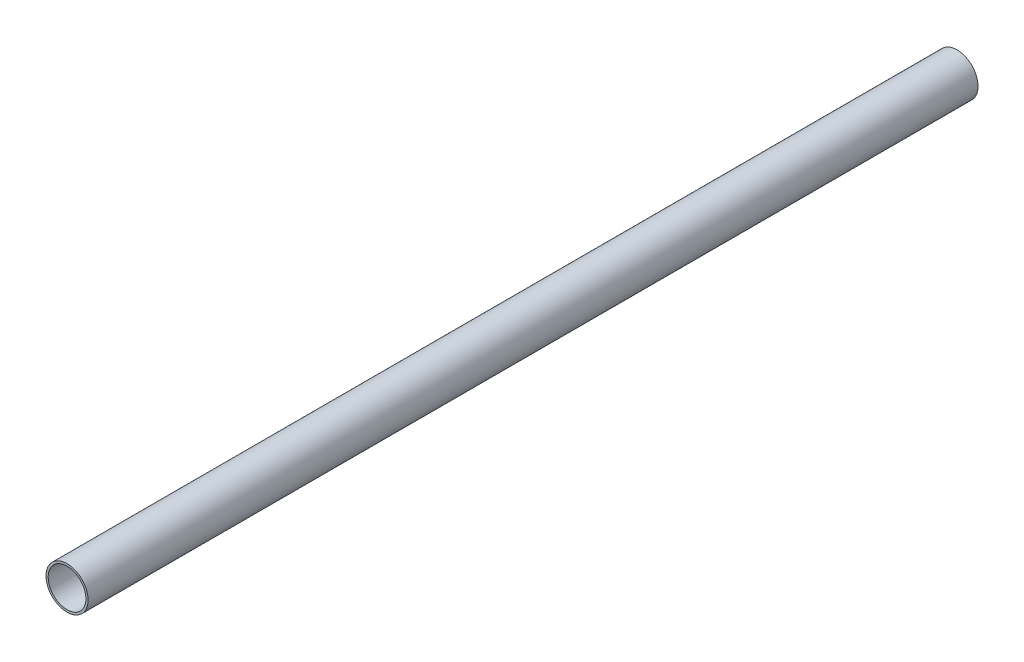
ISO-10303-21;
HEADER;
FILE_DESCRIPTION(('STEP AP214'),'2;1');
FILE_NAME('part.step','',(''),(''),'','','');
FILE_SCHEMA(('AUTOMOTIVE_DESIGN { 1 0 10303 214 1 1 1 1 }'));
ENDSEC;
DATA;
#1=APPLICATION_CONTEXT('core data for automotive mechanical design processes');
#2=APPLICATION_PROTOCOL_DEFINITION('international standard','automotive_design',2000,#1);
#3=PRODUCT_CONTEXT('',#1,'mechanical');
#4=PRODUCT('Part','Part','',(#3));
#5=PRODUCT_RELATED_PRODUCT_CATEGORY('part','',(#4));
#6=PRODUCT_DEFINITION_FORMATION('','',#4);
#7=PRODUCT_DEFINITION_CONTEXT('part definition',#1,'design');
#8=PRODUCT_DEFINITION('design','',#6,#7);
#9=PRODUCT_DEFINITION_SHAPE('','',#8);
#10=(LENGTH_UNIT() NAMED_UNIT(*) SI_UNIT(.MILLI.,.METRE.));
#11=(NAMED_UNIT(*) PLANE_ANGLE_UNIT() SI_UNIT($,.RADIAN.));
#12=(NAMED_UNIT(*) SI_UNIT($,.STERADIAN.) SOLID_ANGLE_UNIT());
#13=UNCERTAINTY_MEASURE_WITH_UNIT(LENGTH_MEASURE(1.E-05),#10,'distance_accuracy_value','');
#14=(GEOMETRIC_REPRESENTATION_CONTEXT(3) GLOBAL_UNCERTAINTY_ASSIGNED_CONTEXT((#13)) GLOBAL_UNIT_ASSIGNED_CONTEXT((#10,
#11,#12)) REPRESENTATION_CONTEXT('',''));
#15=CARTESIAN_POINT('',(0.,0.,0.));
#16=DIRECTION('',(0.,0.,1.));
#17=DIRECTION('',(1.,0.,0.));
#18=AXIS2_PLACEMENT_3D('',#15,#16,#17);
#19=CARTESIAN_POINT('',(0.,0.,235.));
#20=DIRECTION('',(0.,0.,1.));
#21=DIRECTION('',(1.,0.,0.));
#22=AXIS2_PLACEMENT_3D('',#19,#20,#21);
#23=PLANE('',#22);
#24=CARTESIAN_POINT('',(0.,0.,235.));
#25=DIRECTION('',(0.,0.,1.));
#26=DIRECTION('',(1.,0.,0.));
#27=AXIS2_PLACEMENT_3D('',#24,#25,#26);
#28=CIRCLE('',#27,11.1125);
#29=CARTESIAN_POINT('',(-11.1125,0.,235.));
#30=VERTEX_POINT('',#29);
#31=EDGE_CURVE('E10',#30,#30,#28,.T.);
#32=ORIENTED_EDGE('',*,*,#31,.T.);
#33=EDGE_LOOP('',(#32));
#34=FACE_BOUND('',#33,.T.);
#35=CARTESIAN_POINT('',(0.,0.,235.));
#36=DIRECTION('',(0.,0.,1.));
#37=DIRECTION('',(1.,0.,0.));
#38=AXIS2_PLACEMENT_3D('',#35,#36,#37);
#39=CIRCLE('',#38,9.9695);
#40=CARTESIAN_POINT('',(-9.9695,0.,235.));
#41=VERTEX_POINT('',#40);
#42=EDGE_CURVE('E41',#41,#41,#39,.T.);
#43=ORIENTED_EDGE('',*,*,#42,.F.);
#44=EDGE_LOOP('',(#43));
#45=FACE_BOUND('',#44,.T.);
#46=ADVANCED_FACE('F30',(#34,#45),#23,.T.);
#47=CARTESIAN_POINT('',(0.,0.,-235.));
#48=DIRECTION('',(0.,0.,1.));
#49=DIRECTION('',(1.,0.,0.));
#50=AXIS2_PLACEMENT_3D('',#47,#48,#49);
#51=PLANE('',#50);
#52=CARTESIAN_POINT('',(0.,0.,-235.));
#53=DIRECTION('',(0.,0.,1.));
#54=DIRECTION('',(1.,0.,0.));
#55=AXIS2_PLACEMENT_3D('',#52,#53,#54);
#56=CIRCLE('',#55,11.1125);
#57=CARTESIAN_POINT('',(-11.1125,0.,-235.));
#58=VERTEX_POINT('',#57);
#59=EDGE_CURVE('E34',#58,#58,#56,.T.);
#60=ORIENTED_EDGE('',*,*,#59,.F.);
#61=EDGE_LOOP('',(#60));
#62=FACE_BOUND('',#61,.T.);
#63=CARTESIAN_POINT('',(0.,0.,-235.));
#64=DIRECTION('',(0.,0.,1.));
#65=DIRECTION('',(1.,0.,0.));
#66=AXIS2_PLACEMENT_3D('',#63,#64,#65);
#67=CIRCLE('',#66,9.9695);
#68=CARTESIAN_POINT('',(-9.9695,0.,-235.));
#69=VERTEX_POINT('',#68);
#70=EDGE_CURVE('E43',#69,#69,#67,.T.);
#71=ORIENTED_EDGE('',*,*,#70,.T.);
#72=EDGE_LOOP('',(#71));
#73=FACE_BOUND('',#72,.T.);
#74=ADVANCED_FACE('F53',(#62,#73),#51,.F.);
#75=CARTESIAN_POINT('',(0.,0.,235.));
#76=DIRECTION('',(0.,0.,-1.));
#77=DIRECTION('',(-1.,0.,0.));
#78=AXIS2_PLACEMENT_3D('',#75,#76,#77);
#79=CYLINDRICAL_SURFACE('',#78,11.1125);
#80=CARTESIAN_POINT('',(-11.1125,0.,235.));
#81=CARTESIAN_POINT('',(-11.1125,0.,230.104166666667));
#82=CARTESIAN_POINT('',(-11.1125,0.,225.208333333333));
#83=CARTESIAN_POINT('',(-11.1125,0.,215.416666666667));
#84=CARTESIAN_POINT('',(-11.1125,0.,210.520833333333));
#85=CARTESIAN_POINT('',(-11.1125,0.,200.729166666667));
#86=CARTESIAN_POINT('',(-11.1125,0.,195.833333333333));
#87=CARTESIAN_POINT('',(-11.1125,0.,186.041666666667));
#88=CARTESIAN_POINT('',(-11.1125,0.,181.145833333333));
#89=CARTESIAN_POINT('',(-11.1125,0.,171.354166666667));
#90=CARTESIAN_POINT('',(-11.1125,0.,166.458333333333));
#91=CARTESIAN_POINT('',(-11.1125,0.,156.666666666667));
#92=CARTESIAN_POINT('',(-11.1125,0.,151.770833333333));
#93=CARTESIAN_POINT('',(-11.1125,0.,141.979166666667));
#94=CARTESIAN_POINT('',(-11.1125,0.,137.083333333333));
#95=CARTESIAN_POINT('',(-11.1125,0.,127.291666666667));
#96=CARTESIAN_POINT('',(-11.1125,0.,122.395833333333));
#97=CARTESIAN_POINT('',(-11.1125,0.,112.604166666667));
#98=CARTESIAN_POINT('',(-11.1125,0.,107.708333333333));
#99=CARTESIAN_POINT('',(-11.1125,0.,97.9166666666666));
#100=CARTESIAN_POINT('',(-11.1125,0.,93.0208333333333));
#101=CARTESIAN_POINT('',(-11.1125,0.,83.2291666666666));
#102=CARTESIAN_POINT('',(-11.1125,0.,78.3333333333333));
#103=CARTESIAN_POINT('',(-11.1125,0.,68.5416666666666));
#104=CARTESIAN_POINT('',(-11.1125,0.,63.6458333333333));
#105=CARTESIAN_POINT('',(-11.1125,0.,53.8541666666666));
#106=CARTESIAN_POINT('',(-11.1125,0.,48.9583333333333));
#107=CARTESIAN_POINT('',(-11.1125,0.,39.1666666666666));
#108=CARTESIAN_POINT('',(-11.1125,0.,34.2708333333333));
#109=CARTESIAN_POINT('',(-11.1125,0.,24.4791666666666));
#110=CARTESIAN_POINT('',(-11.1125,0.,19.5833333333333));
#111=CARTESIAN_POINT('',(-11.1125,0.,9.79166666666661));
#112=CARTESIAN_POINT('',(-11.1125,0.,4.89583333333327));
#113=CARTESIAN_POINT('',(-11.1125,0.,-4.89583333333339));
#114=CARTESIAN_POINT('',(-11.1125,0.,-9.79166666666672));
#115=CARTESIAN_POINT('',(-11.1125,0.,-19.5833333333334));
#116=CARTESIAN_POINT('',(-11.1125,0.,-24.4791666666667));
#117=CARTESIAN_POINT('',(-11.1125,0.,-34.2708333333333));
#118=CARTESIAN_POINT('',(-11.1125,0.,-39.1666666666667));
#119=CARTESIAN_POINT('',(-11.1125,0.,-48.9583333333333));
#120=CARTESIAN_POINT('',(-11.1125,0.,-53.8541666666667));
#121=CARTESIAN_POINT('',(-11.1125,0.,-63.6458333333333));
#122=CARTESIAN_POINT('',(-11.1125,0.,-68.5416666666667));
#123=CARTESIAN_POINT('',(-11.1125,0.,-78.3333333333333));
#124=CARTESIAN_POINT('',(-11.1125,0.,-83.2291666666667));
#125=CARTESIAN_POINT('',(-11.1125,0.,-93.0208333333333));
#126=CARTESIAN_POINT('',(-11.1125,0.,-97.9166666666667));
#127=CARTESIAN_POINT('',(-11.1125,0.,-107.708333333333));
#128=CARTESIAN_POINT('',(-11.1125,0.,-112.604166666667));
#129=CARTESIAN_POINT('',(-11.1125,0.,-122.395833333333));
#130=CARTESIAN_POINT('',(-11.1125,0.,-127.291666666667));
#131=CARTESIAN_POINT('',(-11.1125,0.,-137.083333333333));
#132=CARTESIAN_POINT('',(-11.1125,0.,-141.979166666667));
#133=CARTESIAN_POINT('',(-11.1125,0.,-151.770833333333));
#134=CARTESIAN_POINT('',(-11.1125,0.,-156.666666666667));
#135=CARTESIAN_POINT('',(-11.1125,0.,-166.458333333333));
#136=CARTESIAN_POINT('',(-11.1125,0.,-171.354166666667));
#137=CARTESIAN_POINT('',(-11.1125,0.,-181.145833333333));
#138=CARTESIAN_POINT('',(-11.1125,0.,-186.041666666667));
#139=CARTESIAN_POINT('',(-11.1125,0.,-195.833333333333));
#140=CARTESIAN_POINT('',(-11.1125,0.,-200.729166666667));
#141=CARTESIAN_POINT('',(-11.1125,0.,-210.520833333333));
#142=CARTESIAN_POINT('',(-11.1125,0.,-215.416666666667));
#143=CARTESIAN_POINT('',(-11.1125,0.,-225.208333333333));
#144=CARTESIAN_POINT('',(-11.1125,0.,-230.104166666667));
#145=CARTESIAN_POINT('',(-11.1125,0.,-235.));
#146=B_SPLINE_CURVE_WITH_KNOTS('',3,(#80,#81,#82,#83,#84,#85,#86,#87,#88,#89,#90,#91,#92,#93,
#94,#95,#96,#97,#98,#99,#100,#101,#102,#103,#104,#105,#106,#107,#108,#109,#110,#111,#112,#113,
#114,#115,#116,#117,#118,#119,#120,#121,#122,#123,#124,#125,#126,#127,#128,#129,#130,#131,#132,
#133,#134,#135,#136,#137,#138,#139,#140,#141,#142,#143,#144,#145),.UNSPECIFIED.,.F.,.F.,(4,2,2,
2,2,2,2,2,2,2,2,2,2,2,2,2,2,2,2,2,2,2,2,2,2,2,2,2,2,2,2,2,4),(0.,14.6875,29.375,44.0625,58.75,
73.4375,88.125,102.8125,117.5,132.1875,146.875,161.5625,176.25,190.9375,205.625,220.3125,235.,
249.6875,264.375,279.0625,293.75,308.4375,323.125,337.8125,352.5,367.1875,381.875,396.5625,
411.25,425.9375,440.625,455.3125,470.),.UNSPECIFIED.);
#147=EDGE_CURVE('BSEAM32',#30,#58,#146,.T.);
#148=ORIENTED_EDGE('',*,*,#31,.F.);
#149=ORIENTED_EDGE('',*,*,#59,.T.);
#150=ORIENTED_EDGE('',*,*,#147,.T.);
#151=ORIENTED_EDGE('',*,*,#147,.F.);
#152=EDGE_LOOP('',(#148,#150,#149,#151));
#153=FACE_BOUND('',#152,.T.);
#154=ADVANCED_FACE('F32',(#153),#79,.T.);
#155=CARTESIAN_POINT('',(0.,0.,235.));
#156=DIRECTION('',(0.,0.,-1.));
#157=DIRECTION('',(-1.,0.,0.));
#158=AXIS2_PLACEMENT_3D('',#155,#156,#157);
#159=CYLINDRICAL_SURFACE('',#158,9.9695);
#160=CARTESIAN_POINT('',(-9.9695,0.,235.));
#161=CARTESIAN_POINT('',(-9.9695,0.,230.104166666667));
#162=CARTESIAN_POINT('',(-9.9695,0.,225.208333333333));
#163=CARTESIAN_POINT('',(-9.9695,0.,215.416666666667));
#164=CARTESIAN_POINT('',(-9.9695,0.,210.520833333333));
#165=CARTESIAN_POINT('',(-9.9695,0.,200.729166666667));
#166=CARTESIAN_POINT('',(-9.9695,0.,195.833333333333));
#167=CARTESIAN_POINT('',(-9.9695,0.,186.041666666667));
#168=CARTESIAN_POINT('',(-9.9695,0.,181.145833333333));
#169=CARTESIAN_POINT('',(-9.9695,0.,171.354166666667));
#170=CARTESIAN_POINT('',(-9.9695,0.,166.458333333333));
#171=CARTESIAN_POINT('',(-9.9695,0.,156.666666666667));
#172=CARTESIAN_POINT('',(-9.9695,0.,151.770833333333));
#173=CARTESIAN_POINT('',(-9.9695,0.,141.979166666667));
#174=CARTESIAN_POINT('',(-9.9695,0.,137.083333333333));
#175=CARTESIAN_POINT('',(-9.9695,0.,127.291666666667));
#176=CARTESIAN_POINT('',(-9.9695,0.,122.395833333333));
#177=CARTESIAN_POINT('',(-9.9695,0.,112.604166666667));
#178=CARTESIAN_POINT('',(-9.9695,0.,107.708333333333));
#179=CARTESIAN_POINT('',(-9.9695,0.,97.9166666666666));
#180=CARTESIAN_POINT('',(-9.9695,0.,93.0208333333333));
#181=CARTESIAN_POINT('',(-9.9695,0.,83.2291666666666));
#182=CARTESIAN_POINT('',(-9.9695,0.,78.3333333333333));
#183=CARTESIAN_POINT('',(-9.9695,0.,68.5416666666666));
#184=CARTESIAN_POINT('',(-9.9695,0.,63.6458333333333));
#185=CARTESIAN_POINT('',(-9.9695,0.,53.8541666666666));
#186=CARTESIAN_POINT('',(-9.9695,0.,48.9583333333333));
#187=CARTESIAN_POINT('',(-9.9695,0.,39.1666666666666));
#188=CARTESIAN_POINT('',(-9.9695,0.,34.2708333333333));
#189=CARTESIAN_POINT('',(-9.9695,0.,24.4791666666666));
#190=CARTESIAN_POINT('',(-9.9695,0.,19.5833333333333));
#191=CARTESIAN_POINT('',(-9.9695,0.,9.79166666666661));
#192=CARTESIAN_POINT('',(-9.9695,0.,4.89583333333327));
#193=CARTESIAN_POINT('',(-9.9695,0.,-4.89583333333339));
#194=CARTESIAN_POINT('',(-9.9695,0.,-9.79166666666672));
#195=CARTESIAN_POINT('',(-9.9695,0.,-19.5833333333334));
#196=CARTESIAN_POINT('',(-9.9695,0.,-24.4791666666667));
#197=CARTESIAN_POINT('',(-9.9695,0.,-34.2708333333333));
#198=CARTESIAN_POINT('',(-9.9695,0.,-39.1666666666667));
#199=CARTESIAN_POINT('',(-9.9695,0.,-48.9583333333333));
#200=CARTESIAN_POINT('',(-9.9695,0.,-53.8541666666667));
#201=CARTESIAN_POINT('',(-9.9695,0.,-63.6458333333333));
#202=CARTESIAN_POINT('',(-9.9695,0.,-68.5416666666667));
#203=CARTESIAN_POINT('',(-9.9695,0.,-78.3333333333333));
#204=CARTESIAN_POINT('',(-9.9695,0.,-83.2291666666667));
#205=CARTESIAN_POINT('',(-9.9695,0.,-93.0208333333333));
#206=CARTESIAN_POINT('',(-9.9695,0.,-97.9166666666667));
#207=CARTESIAN_POINT('',(-9.9695,0.,-107.708333333333));
#208=CARTESIAN_POINT('',(-9.9695,0.,-112.604166666667));
#209=CARTESIAN_POINT('',(-9.9695,0.,-122.395833333333));
#210=CARTESIAN_POINT('',(-9.9695,0.,-127.291666666667));
#211=CARTESIAN_POINT('',(-9.9695,0.,-137.083333333333));
#212=CARTESIAN_POINT('',(-9.9695,0.,-141.979166666667));
#213=CARTESIAN_POINT('',(-9.9695,0.,-151.770833333333));
#214=CARTESIAN_POINT('',(-9.9695,0.,-156.666666666667));
#215=CARTESIAN_POINT('',(-9.9695,0.,-166.458333333333));
#216=CARTESIAN_POINT('',(-9.9695,0.,-171.354166666667));
#217=CARTESIAN_POINT('',(-9.9695,0.,-181.145833333333));
#218=CARTESIAN_POINT('',(-9.9695,0.,-186.041666666667));
#219=CARTESIAN_POINT('',(-9.9695,0.,-195.833333333333));
#220=CARTESIAN_POINT('',(-9.9695,0.,-200.729166666667));
#221=CARTESIAN_POINT('',(-9.9695,0.,-210.520833333333));
#222=CARTESIAN_POINT('',(-9.9695,0.,-215.416666666667));
#223=CARTESIAN_POINT('',(-9.9695,0.,-225.208333333333));
#224=CARTESIAN_POINT('',(-9.9695,0.,-230.104166666667));
#225=CARTESIAN_POINT('',(-9.9695,0.,-235.));
#226=B_SPLINE_CURVE_WITH_KNOTS('',3,(#160,#161,#162,#163,#164,#165,#166,#167,#168,#169,#170,
#171,#172,#173,#174,#175,#176,#177,#178,#179,#180,#181,#182,#183,#184,#185,#186,#187,#188,#189,
#190,#191,#192,#193,#194,#195,#196,#197,#198,#199,#200,#201,#202,#203,#204,#205,#206,#207,#208,
#209,#210,#211,#212,#213,#214,#215,#216,#217,#218,#219,#220,#221,#222,#223,#224,#225),
.UNSPECIFIED.,.F.,.F.,(4,2,2,2,2,2,2,2,2,2,2,2,2,2,2,2,2,2,2,2,2,2,2,2,2,2,2,2,2,2,2,2,4),(0.,
14.6875,29.375,44.0625,58.75,73.4375,88.125,102.8125,117.5,132.1875,146.875,161.5625,176.25,
190.9375,205.625,220.3125,235.,249.6875,264.375,279.0625,293.75,308.4375,323.125,337.8125,352.5,
367.1875,381.875,396.5625,411.25,425.9375,440.625,455.3125,470.),.UNSPECIFIED.);
#227=EDGE_CURVE('BSEAM49',#41,#69,#226,.T.);
#228=ORIENTED_EDGE('',*,*,#42,.T.);
#229=ORIENTED_EDGE('',*,*,#70,.F.);
#230=ORIENTED_EDGE('',*,*,#227,.T.);
#231=ORIENTED_EDGE('',*,*,#227,.F.);
#232=EDGE_LOOP('',(#228,#230,#229,#231));
#233=FACE_BOUND('',#232,.T.);
#234=ADVANCED_FACE('F49',(#233),#159,.F.);
#235=CLOSED_SHELL('',(#46,#74,#154,#234));
#236=MANIFOLD_SOLID_BREP('B2',#235);
#237=ADVANCED_BREP_SHAPE_REPRESENTATION('',(#18,#236),#14);
#238=SHAPE_DEFINITION_REPRESENTATION(#9,#237);
ENDSEC;
END-ISO-10303-21;
